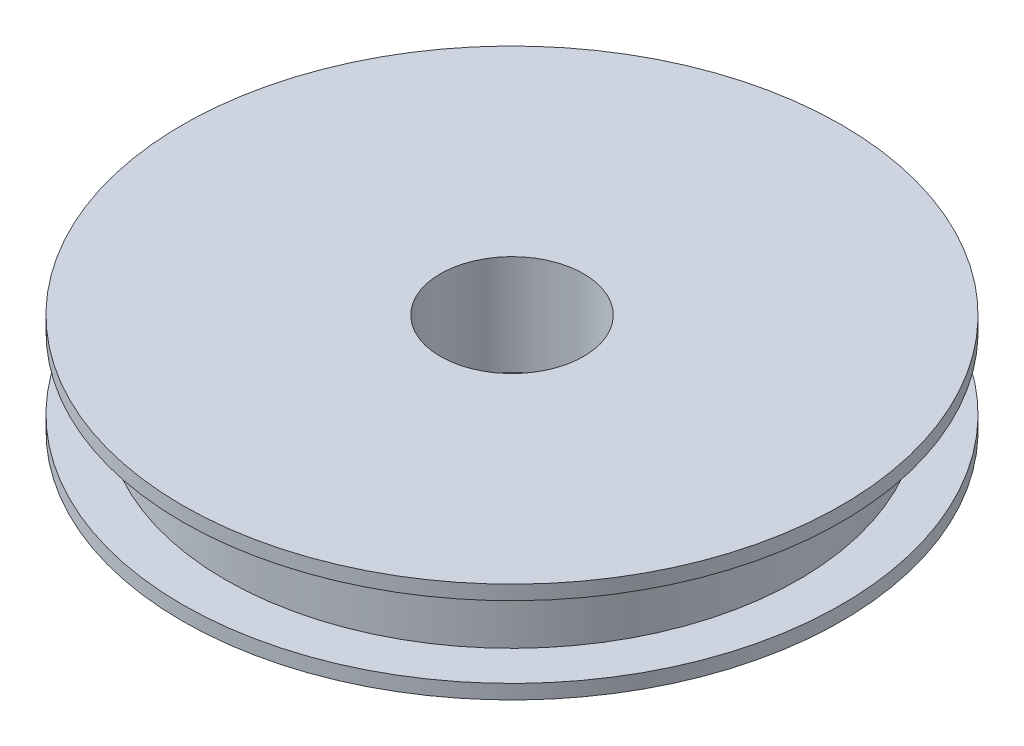
ISO-10303-21;
HEADER;
FILE_DESCRIPTION(('STEP AP214'),'2;1');
FILE_NAME('part.step','',(''),(''),'','','');
FILE_SCHEMA(('AUTOMOTIVE_DESIGN { 1 0 10303 214 1 1 1 1 }'));
ENDSEC;
DATA;
#1=APPLICATION_CONTEXT('core data for automotive mechanical design processes');
#2=APPLICATION_PROTOCOL_DEFINITION('international standard','automotive_design',2000,#1);
#3=PRODUCT_CONTEXT('',#1,'mechanical');
#4=PRODUCT('Part','Part','',(#3));
#5=PRODUCT_RELATED_PRODUCT_CATEGORY('part','',(#4));
#6=PRODUCT_DEFINITION_FORMATION('','',#4);
#7=PRODUCT_DEFINITION_CONTEXT('part definition',#1,'design');
#8=PRODUCT_DEFINITION('design','',#6,#7);
#9=PRODUCT_DEFINITION_SHAPE('','',#8);
#10=(LENGTH_UNIT() NAMED_UNIT(*) SI_UNIT(.MILLI.,.METRE.));
#11=(NAMED_UNIT(*) PLANE_ANGLE_UNIT() SI_UNIT($,.RADIAN.));
#12=(NAMED_UNIT(*) SI_UNIT($,.STERADIAN.) SOLID_ANGLE_UNIT());
#13=UNCERTAINTY_MEASURE_WITH_UNIT(LENGTH_MEASURE(1.E-05),#10,'distance_accuracy_value','');
#14=(GEOMETRIC_REPRESENTATION_CONTEXT(3) GLOBAL_UNCERTAINTY_ASSIGNED_CONTEXT((#13)) GLOBAL_UNIT_ASSIGNED_CONTEXT((#10,
#11,#12)) REPRESENTATION_CONTEXT('',''));
#15=CARTESIAN_POINT('',(0.,0.,0.));
#16=DIRECTION('',(0.,0.,1.));
#17=DIRECTION('',(1.,0.,0.));
#18=AXIS2_PLACEMENT_3D('',#15,#16,#17);
#19=CARTESIAN_POINT('',(0.,5.,0.));
#20=DIRECTION('',(0.,-1.,0.));
#21=DIRECTION('',(0.,0.,-1.));
#22=AXIS2_PLACEMENT_3D('',#19,#20,#21);
#23=CYLINDRICAL_SURFACE('',#22,5.);
#24=CARTESIAN_POINT('',(0.,-1.,0.));
#25=DIRECTION('',(0.,1.,0.));
#26=DIRECTION('',(0.,0.,1.));
#27=AXIS2_PLACEMENT_3D('',#24,#25,#26);
#28=CIRCLE('',#27,5.);
#29=CARTESIAN_POINT('',(0.,-1.,5.));
#30=VERTEX_POINT('',#29);
#31=EDGE_CURVE('E49',#30,#30,#28,.T.);
#32=ORIENTED_EDGE('',*,*,#31,.F.);
#33=EDGE_LOOP('',(#32));
#34=FACE_BOUND('',#33,.T.);
#35=CARTESIAN_POINT('',(0.,6.,0.));
#36=DIRECTION('',(0.,1.,0.));
#37=DIRECTION('',(0.,0.,1.));
#38=AXIS2_PLACEMENT_3D('',#35,#36,#37);
#39=CIRCLE('',#38,5.);
#40=CARTESIAN_POINT('',(0.,6.,5.));
#41=VERTEX_POINT('',#40);
#42=EDGE_CURVE('E63',#41,#41,#39,.T.);
#43=ORIENTED_EDGE('',*,*,#42,.T.);
#44=EDGE_LOOP('',(#43));
#45=FACE_BOUND('',#44,.T.);
#46=ADVANCED_FACE('F39',(#34,#45),#23,.F.);
#47=CARTESIAN_POINT('',(0.,5.,0.));
#48=DIRECTION('',(0.,-1.,0.));
#49=DIRECTION('',(0.,0.,-1.));
#50=AXIS2_PLACEMENT_3D('',#47,#48,#49);
#51=CYLINDRICAL_SURFACE('',#50,20.);
#52=CARTESIAN_POINT('',(0.,5.,0.));
#53=DIRECTION('',(0.,1.,0.));
#54=DIRECTION('',(0.,0.,1.));
#55=AXIS2_PLACEMENT_3D('',#52,#53,#54);
#56=CIRCLE('',#55,20.);
#57=CARTESIAN_POINT('',(0.,5.,20.));
#58=VERTEX_POINT('',#57);
#59=EDGE_CURVE('E11',#58,#58,#56,.T.);
#60=ORIENTED_EDGE('',*,*,#59,.F.);
#61=EDGE_LOOP('',(#60));
#62=FACE_BOUND('',#61,.T.);
#63=CARTESIAN_POINT('',(0.,0.,0.));
#64=DIRECTION('',(0.,1.,0.));
#65=DIRECTION('',(0.,0.,1.));
#66=AXIS2_PLACEMENT_3D('',#63,#64,#65);
#67=CIRCLE('',#66,20.);
#68=CARTESIAN_POINT('',(0.,0.,20.));
#69=VERTEX_POINT('',#68);
#70=EDGE_CURVE('E42',#69,#69,#67,.T.);
#71=ORIENTED_EDGE('',*,*,#70,.T.);
#72=EDGE_LOOP('',(#71));
#73=FACE_BOUND('',#72,.T.);
#74=ADVANCED_FACE('F86',(#62,#73),#51,.T.);
#75=CARTESIAN_POINT('',(0.,-1.,0.));
#76=DIRECTION('',(0.,1.,0.));
#77=DIRECTION('',(0.,0.,1.));
#78=AXIS2_PLACEMENT_3D('',#75,#76,#77);
#79=CYLINDRICAL_SURFACE('',#78,23.);
#80=CARTESIAN_POINT('',(0.,-1.,0.));
#81=DIRECTION('',(0.,1.,0.));
#82=DIRECTION('',(0.,0.,1.));
#83=AXIS2_PLACEMENT_3D('',#80,#81,#82);
#84=CIRCLE('',#83,23.);
#85=CARTESIAN_POINT('',(0.,-1.,23.));
#86=VERTEX_POINT('',#85);
#87=EDGE_CURVE('E54',#86,#86,#84,.T.);
#88=ORIENTED_EDGE('',*,*,#87,.T.);
#89=EDGE_LOOP('',(#88));
#90=FACE_BOUND('',#89,.T.);
#91=CARTESIAN_POINT('',(0.,0.,0.));
#92=DIRECTION('',(0.,1.,0.));
#93=DIRECTION('',(0.,0.,1.));
#94=AXIS2_PLACEMENT_3D('',#91,#92,#93);
#95=CIRCLE('',#94,23.);
#96=CARTESIAN_POINT('',(0.,0.,23.));
#97=VERTEX_POINT('',#96);
#98=EDGE_CURVE('E51',#97,#97,#95,.T.);
#99=ORIENTED_EDGE('',*,*,#98,.F.);
#100=EDGE_LOOP('',(#99));
#101=FACE_BOUND('',#100,.T.);
#102=ADVANCED_FACE('F91',(#90,#101),#79,.T.);
#103=CARTESIAN_POINT('',(0.,-1.,0.));
#104=DIRECTION('',(0.,1.,0.));
#105=DIRECTION('',(0.,0.,1.));
#106=AXIS2_PLACEMENT_3D('',#103,#104,#105);
#107=PLANE('',#106);
#108=ORIENTED_EDGE('',*,*,#87,.F.);
#109=EDGE_LOOP('',(#108));
#110=FACE_BOUND('',#109,.T.);
#111=ORIENTED_EDGE('',*,*,#31,.T.);
#112=EDGE_LOOP('',(#111));
#113=FACE_BOUND('',#112,.T.);
#114=ADVANCED_FACE('F82',(#110,#113),#107,.F.);
#115=CARTESIAN_POINT('',(0.,0.,0.));
#116=DIRECTION('',(0.,1.,0.));
#117=DIRECTION('',(0.,0.,1.));
#118=AXIS2_PLACEMENT_3D('',#115,#116,#117);
#119=PLANE('',#118);
#120=ORIENTED_EDGE('',*,*,#70,.F.);
#121=EDGE_LOOP('',(#120));
#122=FACE_BOUND('',#121,.T.);
#123=ORIENTED_EDGE('',*,*,#98,.T.);
#124=EDGE_LOOP('',(#123));
#125=FACE_BOUND('',#124,.T.);
#126=ADVANCED_FACE('F73',(#122,#125),#119,.T.);
#127=CARTESIAN_POINT('',(0.,6.,0.));
#128=DIRECTION('',(0.,1.,0.));
#129=DIRECTION('',(0.,0.,1.));
#130=AXIS2_PLACEMENT_3D('',#127,#128,#129);
#131=PLANE('',#130);
#132=CARTESIAN_POINT('',(0.,6.,0.));
#133=DIRECTION('',(0.,1.,0.));
#134=DIRECTION('',(0.,0.,1.));
#135=AXIS2_PLACEMENT_3D('',#132,#133,#134);
#136=CIRCLE('',#135,23.);
#137=CARTESIAN_POINT('',(0.,6.,23.));
#138=VERTEX_POINT('',#137);
#139=EDGE_CURVE('E55',#138,#138,#136,.T.);
#140=ORIENTED_EDGE('',*,*,#139,.T.);
#141=EDGE_LOOP('',(#140));
#142=FACE_BOUND('',#141,.T.);
#143=ORIENTED_EDGE('',*,*,#42,.F.);
#144=EDGE_LOOP('',(#143));
#145=FACE_BOUND('',#144,.T.);
#146=ADVANCED_FACE('F70',(#142,#145),#131,.T.);
#147=CARTESIAN_POINT('',(0.,5.,0.));
#148=DIRECTION('',(0.,1.,0.));
#149=DIRECTION('',(0.,0.,1.));
#150=AXIS2_PLACEMENT_3D('',#147,#148,#149);
#151=PLANE('',#150);
#152=ORIENTED_EDGE('',*,*,#59,.T.);
#153=EDGE_LOOP('',(#152));
#154=FACE_BOUND('',#153,.T.);
#155=CARTESIAN_POINT('',(0.,5.,0.));
#156=DIRECTION('',(0.,1.,0.));
#157=DIRECTION('',(0.,0.,1.));
#158=AXIS2_PLACEMENT_3D('',#155,#156,#157);
#159=CIRCLE('',#158,23.);
#160=CARTESIAN_POINT('',(0.,5.,23.));
#161=VERTEX_POINT('',#160);
#162=EDGE_CURVE('E60',#161,#161,#159,.T.);
#163=ORIENTED_EDGE('',*,*,#162,.F.);
#164=EDGE_LOOP('',(#163));
#165=FACE_BOUND('',#164,.T.);
#166=ADVANCED_FACE('F72',(#154,#165),#151,.F.);
#167=CARTESIAN_POINT('',(0.,6.,0.));
#168=DIRECTION('',(0.,-1.,0.));
#169=DIRECTION('',(0.,0.,-1.));
#170=AXIS2_PLACEMENT_3D('',#167,#168,#169);
#171=CYLINDRICAL_SURFACE('',#170,23.);
#172=ORIENTED_EDGE('',*,*,#139,.F.);
#173=EDGE_LOOP('',(#172));
#174=FACE_BOUND('',#173,.T.);
#175=ORIENTED_EDGE('',*,*,#162,.T.);
#176=EDGE_LOOP('',(#175));
#177=FACE_BOUND('',#176,.T.);
#178=ADVANCED_FACE('F80',(#174,#177),#171,.T.);
#179=CLOSED_SHELL('',(#46,#74,#102,#114,#126,#146,#166,#178));
#180=MANIFOLD_SOLID_BREP('B2',#179);
#181=ADVANCED_BREP_SHAPE_REPRESENTATION('',(#18,#180),#14);
#182=SHAPE_DEFINITION_REPRESENTATION(#9,#181);
ENDSEC;
END-ISO-10303-21;
